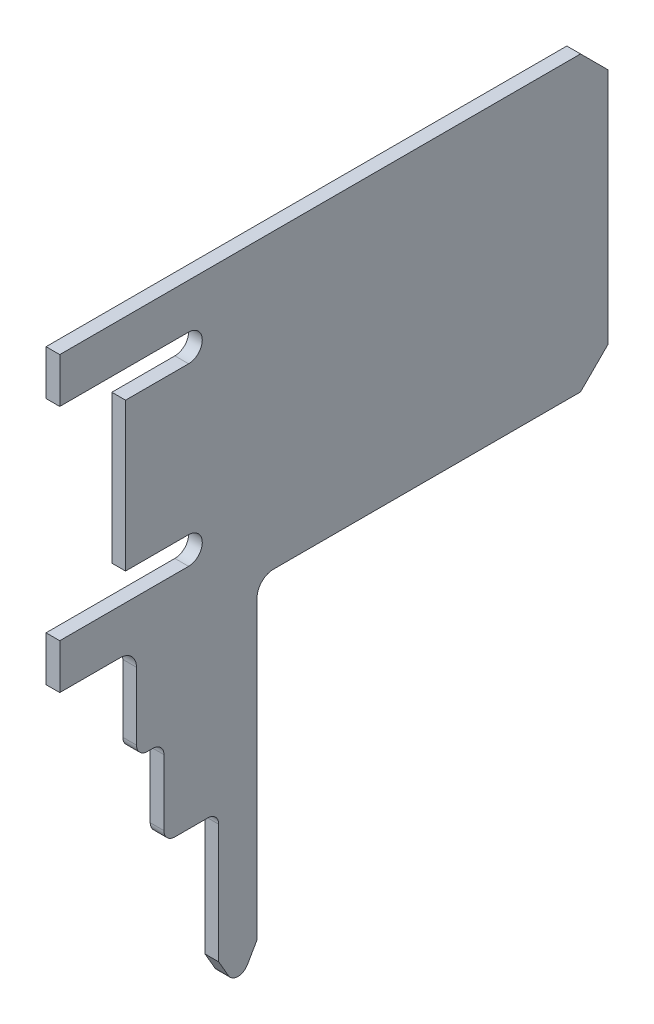
ISO-10303-21;
HEADER;
FILE_DESCRIPTION(('STEP AP214'),'2;1');
FILE_NAME('part.step','',(''),(''),'','','');
FILE_SCHEMA(('AUTOMOTIVE_DESIGN { 1 0 10303 214 1 1 1 1 }'));
ENDSEC;
DATA;
#1=APPLICATION_CONTEXT('core data for automotive mechanical design processes');
#2=APPLICATION_PROTOCOL_DEFINITION('international standard','automotive_design',2000,#1);
#3=PRODUCT_CONTEXT('',#1,'mechanical');
#4=PRODUCT('Part','Part','',(#3));
#5=PRODUCT_RELATED_PRODUCT_CATEGORY('part','',(#4));
#6=PRODUCT_DEFINITION_FORMATION('','',#4);
#7=PRODUCT_DEFINITION_CONTEXT('part definition',#1,'design');
#8=PRODUCT_DEFINITION('design','',#6,#7);
#9=PRODUCT_DEFINITION_SHAPE('','',#8);
#10=(LENGTH_UNIT() NAMED_UNIT(*) SI_UNIT(.MILLI.,.METRE.));
#11=(NAMED_UNIT(*) PLANE_ANGLE_UNIT() SI_UNIT($,.RADIAN.));
#12=(NAMED_UNIT(*) SI_UNIT($,.STERADIAN.) SOLID_ANGLE_UNIT());
#13=UNCERTAINTY_MEASURE_WITH_UNIT(LENGTH_MEASURE(1.E-05),#10,'distance_accuracy_value','');
#14=(GEOMETRIC_REPRESENTATION_CONTEXT(3) GLOBAL_UNCERTAINTY_ASSIGNED_CONTEXT((#13)) GLOBAL_UNIT_ASSIGNED_CONTEXT((#10,
#11,#12)) REPRESENTATION_CONTEXT('',''));
#15=CARTESIAN_POINT('',(0.,0.,0.));
#16=DIRECTION('',(0.,0.,1.));
#17=DIRECTION('',(1.,0.,0.));
#18=AXIS2_PLACEMENT_3D('',#15,#16,#17);
#19=CARTESIAN_POINT('',(10.88,-39.55963411247,-10.2));
#20=DIRECTION('',(-1.,0.,0.));
#21=DIRECTION('',(0.,0.,1.));
#22=AXIS2_PLACEMENT_3D('',#19,#20,#21);
#23=PLANE('',#22);
#24=CARTESIAN_POINT('',(10.88,-35.15,-1.7));
#25=DIRECTION('',(-1.,0.,0.));
#26=DIRECTION('',(0.,0.,1.));
#27=AXIS2_PLACEMENT_3D('',#24,#25,#26);
#28=CIRCLE('',#27,0.200000000000006);
#29=CARTESIAN_POINT('',(10.88,-35.15,-1.9));
#30=VERTEX_POINT('',#29);
#31=CARTESIAN_POINT('',(10.88,-34.95,-1.7));
#32=VERTEX_POINT('',#31);
#33=EDGE_CURVE('E365',#30,#32,#28,.F.);
#34=ORIENTED_EDGE('',*,*,#33,.T.);
#35=DIRECTION('',(0.,0.,-1.));
#36=VECTOR('',#35,1.);
#37=CARTESIAN_POINT('',(10.88,-34.95,-1.65));
#38=LINE('',#37,#36);
#39=CARTESIAN_POINT('',(10.88,-34.95,-1.6));
#40=VERTEX_POINT('',#39);
#41=EDGE_CURVE('E295',#32,#40,#38,.F.);
#42=ORIENTED_EDGE('',*,*,#41,.T.);
#43=CARTESIAN_POINT('',(10.88,-34.75,-1.6));
#44=DIRECTION('',(1.,0.,0.));
#45=DIRECTION('',(0.,0.,-1.));
#46=AXIS2_PLACEMENT_3D('',#43,#44,#45);
#47=CIRCLE('',#46,0.2);
#48=CARTESIAN_POINT('',(10.88,-34.75,-1.4));
#49=VERTEX_POINT('',#48);
#50=EDGE_CURVE('E363',#40,#49,#47,.F.);
#51=ORIENTED_EDGE('',*,*,#50,.T.);
#52=DIRECTION('',(0.,-1.,0.));
#53=VECTOR('',#52,1.);
#54=CARTESIAN_POINT('',(10.88,-34.135,-1.4));
#55=LINE('',#54,#53);
#56=CARTESIAN_POINT('',(10.88,-33.52,-1.4));
#57=VERTEX_POINT('',#56);
#58=EDGE_CURVE('E291',#49,#57,#55,.F.);
#59=ORIENTED_EDGE('',*,*,#58,.T.);
#60=CARTESIAN_POINT('',(10.88,-33.52,-1.1));
#61=DIRECTION('',(-1.,0.,0.));
#62=DIRECTION('',(0.,0.,1.));
#63=AXIS2_PLACEMENT_3D('',#60,#61,#62);
#64=CIRCLE('',#63,0.299999999999995);
#65=CARTESIAN_POINT('',(10.88,-33.22,-1.1));
#66=VERTEX_POINT('',#65);
#67=EDGE_CURVE('E361',#57,#66,#64,.F.);
#68=ORIENTED_EDGE('',*,*,#67,.T.);
#69=DIRECTION('',(0.,0.,-1.));
#70=VECTOR('',#69,1.);
#71=CARTESIAN_POINT('',(10.88,-33.22,-4.75));
#72=LINE('',#71,#70);
#73=CARTESIAN_POINT('',(10.88,-33.22,0.));
#74=VERTEX_POINT('',#73);
#75=EDGE_CURVE('E285',#66,#74,#72,.F.);
#76=ORIENTED_EDGE('',*,*,#75,.T.);
#77=DIRECTION('',(0.,-1.,0.));
#78=VECTOR('',#77,1.);
#79=CARTESIAN_POINT('',(10.88,-30.55,0.));
#80=LINE('',#79,#78);
#81=CARTESIAN_POINT('',(10.88,-32.4,0.));
#82=VERTEX_POINT('',#81);
#83=EDGE_CURVE('E279',#74,#82,#80,.F.);
#84=ORIENTED_EDGE('',*,*,#83,.T.);
#85=DIRECTION('',(0.,0.,-1.));
#86=VECTOR('',#85,1.);
#87=CARTESIAN_POINT('',(10.88,-32.4,-1.175));
#88=LINE('',#87,#86);
#89=CARTESIAN_POINT('',(10.88,-32.4,-2.35));
#90=VERTEX_POINT('',#89);
#91=EDGE_CURVE('E273',#82,#90,#88,.T.);
#92=ORIENTED_EDGE('',*,*,#91,.T.);
#93=CARTESIAN_POINT('',(10.88,-32.15,-2.35));
#94=DIRECTION('',(-1.,0.,0.));
#95=DIRECTION('',(0.,0.,1.));
#96=AXIS2_PLACEMENT_3D('',#93,#94,#95);
#97=CIRCLE('',#96,0.25);
#98=CARTESIAN_POINT('',(10.88,-31.9,-2.35));
#99=VERTEX_POINT('',#98);
#100=EDGE_CURVE('E359',#90,#99,#97,.F.);
#101=ORIENTED_EDGE('',*,*,#100,.T.);
#102=DIRECTION('',(0.,0.,1.));
#103=VECTOR('',#102,1.);
#104=CARTESIAN_POINT('',(10.88,-31.9,-1.775));
#105=LINE('',#104,#103);
#106=CARTESIAN_POINT('',(10.88,-31.9,-1.2));
#107=VERTEX_POINT('',#106);
#108=EDGE_CURVE('E267',#99,#107,#105,.T.);
#109=ORIENTED_EDGE('',*,*,#108,.T.);
#110=DIRECTION('',(0.,1.,0.));
#111=VECTOR('',#110,1.);
#112=CARTESIAN_POINT('',(10.88,-30.55,-1.2));
#113=LINE('',#112,#111);
#114=CARTESIAN_POINT('',(10.88,-29.2,-1.2));
#115=VERTEX_POINT('',#114);
#116=EDGE_CURVE('E261',#107,#115,#113,.T.);
#117=ORIENTED_EDGE('',*,*,#116,.T.);
#118=DIRECTION('',(0.,0.,-1.));
#119=VECTOR('',#118,1.);
#120=CARTESIAN_POINT('',(10.88,-29.2,-1.775));
#121=LINE('',#120,#119);
#122=CARTESIAN_POINT('',(10.88,-29.2,-2.35));
#123=VERTEX_POINT('',#122);
#124=EDGE_CURVE('E255',#115,#123,#121,.T.);
#125=ORIENTED_EDGE('',*,*,#124,.T.);
#126=CARTESIAN_POINT('',(10.88,-28.95,-2.35));
#127=DIRECTION('',(-1.,0.,0.));
#128=DIRECTION('',(0.,0.,1.));
#129=AXIS2_PLACEMENT_3D('',#126,#127,#128);
#130=CIRCLE('',#129,0.25);
#131=CARTESIAN_POINT('',(10.88,-28.7,-2.35));
#132=VERTEX_POINT('',#131);
#133=EDGE_CURVE('E357',#123,#132,#130,.F.);
#134=ORIENTED_EDGE('',*,*,#133,.T.);
#135=DIRECTION('',(0.,0.,1.));
#136=VECTOR('',#135,1.);
#137=CARTESIAN_POINT('',(10.88,-28.7,-1.175));
#138=LINE('',#137,#136);
#139=CARTESIAN_POINT('',(10.88,-28.7,0.));
#140=VERTEX_POINT('',#139);
#141=EDGE_CURVE('E249',#132,#140,#138,.T.);
#142=ORIENTED_EDGE('',*,*,#141,.T.);
#143=DIRECTION('',(0.,-1.,0.));
#144=VECTOR('',#143,1.);
#145=CARTESIAN_POINT('',(10.88,-30.55,0.));
#146=LINE('',#145,#144);
#147=CARTESIAN_POINT('',(10.88,-27.88,0.));
#148=VERTEX_POINT('',#147);
#149=EDGE_CURVE('E243',#140,#148,#146,.F.);
#150=ORIENTED_EDGE('',*,*,#149,.T.);
#151=DIRECTION('',(0.,0.,1.));
#152=VECTOR('',#151,1.);
#153=CARTESIAN_POINT('',(10.88,-27.88,-4.75));
#154=LINE('',#153,#152);
#155=CARTESIAN_POINT('',(10.88,-27.879999999999,-9.50000000000097));
#156=VERTEX_POINT('',#155);
#157=EDGE_CURVE('E237',#148,#156,#154,.F.);
#158=ORIENTED_EDGE('',*,*,#157,.T.);
#159=DIRECTION('',(0.,0.707106781188558,0.707106781184537));
#160=VECTOR('',#159,1.);
#161=CARTESIAN_POINT('',(10.88,-28.13,-9.7500000000015));
#162=LINE('',#161,#160);
#163=CARTESIAN_POINT('',(10.88,-28.38,-10.));
#164=VERTEX_POINT('',#163);
#165=EDGE_CURVE('E231',#156,#164,#162,.F.);
#166=ORIENTED_EDGE('',*,*,#165,.T.);
#167=DIRECTION('',(0.,1.,0.));
#168=VECTOR('',#167,1.);
#169=CARTESIAN_POINT('',(10.88,-30.55,-10.));
#170=LINE('',#169,#168);
#171=CARTESIAN_POINT('',(10.88,-32.72,-10.));
#172=VERTEX_POINT('',#171);
#173=EDGE_CURVE('E225',#164,#172,#170,.F.);
#174=ORIENTED_EDGE('',*,*,#173,.T.);
#175=DIRECTION('',(0.,0.707106781188558,-0.707106781184537));
#176=VECTOR('',#175,1.);
#177=CARTESIAN_POINT('',(10.88,-32.97,-9.7500000000015));
#178=LINE('',#177,#176);
#179=CARTESIAN_POINT('',(10.88,-33.2200000000005,-9.50000000000049));
#180=VERTEX_POINT('',#179);
#181=EDGE_CURVE('E219',#172,#180,#178,.F.);
#182=ORIENTED_EDGE('',*,*,#181,.T.);
#183=DIRECTION('',(0.,0.,-1.));
#184=VECTOR('',#183,1.);
#185=CARTESIAN_POINT('',(10.88,-33.22,-4.75));
#186=LINE('',#185,#184);
#187=CARTESIAN_POINT('',(10.88,-33.22,-3.9));
#188=VERTEX_POINT('',#187);
#189=EDGE_CURVE('E213',#180,#188,#186,.F.);
#190=ORIENTED_EDGE('',*,*,#189,.T.);
#191=CARTESIAN_POINT('',(10.88,-33.52,-3.9));
#192=DIRECTION('',(1.,0.,0.));
#193=DIRECTION('',(0.,0.,-1.));
#194=AXIS2_PLACEMENT_3D('',#191,#192,#193);
#195=CIRCLE('',#194,0.299999999999995);
#196=CARTESIAN_POINT('',(10.88,-33.52,-3.6));
#197=VERTEX_POINT('',#196);
#198=EDGE_CURVE('E210',#188,#197,#195,.T.);
#199=ORIENTED_EDGE('',*,*,#198,.T.);
#200=DIRECTION('',(0.,1.,0.));
#201=VECTOR('',#200,1.);
#202=CARTESIAN_POINT('',(10.88,-36.221891108675,-3.6));
#203=LINE('',#202,#201);
#204=CARTESIAN_POINT('',(10.88,-38.9237822173496,-3.5999999999995));
#205=VERTEX_POINT('',#204);
#206=EDGE_CURVE('E207',#197,#205,#203,.F.);
#207=ORIENTED_EDGE('',*,*,#206,.T.);
#208=DIRECTION('',(0.,0.866025403786435,-0.499999999996542));
#209=VECTOR('',#208,1.);
#210=CARTESIAN_POINT('',(10.88,-39.076891108675,-3.511602540378));
#211=LINE('',#210,#209);
#212=CARTESIAN_POINT('',(10.88,-39.2299999999997,-3.42320508075714));
#213=VERTEX_POINT('',#212);
#214=EDGE_CURVE('E200',#205,#213,#211,.F.);
#215=ORIENTED_EDGE('',*,*,#214,.T.);
#216=CARTESIAN_POINT('',(10.88,-39.13,-3.25));
#217=DIRECTION('',(-1.,0.,0.));
#218=DIRECTION('',(0.,0.,1.));
#219=AXIS2_PLACEMENT_3D('',#216,#217,#218);
#220=CIRCLE('',#219,0.200000000000001);
#221=CARTESIAN_POINT('',(10.88,-39.2299999999997,-3.07679491924281));
#222=VERTEX_POINT('',#221);
#223=EDGE_CURVE('E352',#213,#222,#220,.T.);
#224=ORIENTED_EDGE('',*,*,#223,.T.);
#225=DIRECTION('',(0.,-0.866025403786436,-0.49999999999654));
#226=VECTOR('',#225,1.);
#227=CARTESIAN_POINT('',(10.88,-39.076891108675,-2.988397459622));
#228=LINE('',#227,#226);
#229=CARTESIAN_POINT('',(10.88,-38.9237822173499,-2.90000000000025));
#230=VERTEX_POINT('',#229);
#231=EDGE_CURVE('E194',#222,#230,#228,.F.);
#232=ORIENTED_EDGE('',*,*,#231,.T.);
#233=DIRECTION('',(0.,-1.,0.));
#234=VECTOR('',#233,1.);
#235=CARTESIAN_POINT('',(10.88,-37.836891108675,-2.9));
#236=LINE('',#235,#234);
#237=CARTESIAN_POINT('',(10.88,-36.75,-2.9));
#238=VERTEX_POINT('',#237);
#239=EDGE_CURVE('E176',#230,#238,#236,.F.);
#240=ORIENTED_EDGE('',*,*,#239,.T.);
#241=CARTESIAN_POINT('',(10.88,-36.75,-2.7));
#242=DIRECTION('',(-1.,0.,0.));
#243=DIRECTION('',(0.,0.,1.));
#244=AXIS2_PLACEMENT_3D('',#241,#242,#243);
#245=CIRCLE('',#244,0.199999999999999);
#246=CARTESIAN_POINT('',(10.88,-36.55,-2.7));
#247=VERTEX_POINT('',#246);
#248=EDGE_CURVE('E20',#247,#238,#245,.T.);
#249=ORIENTED_EDGE('',*,*,#248,.F.);
#250=DIRECTION('',(0.,0.,1.));
#251=VECTOR('',#250,1.);
#252=CARTESIAN_POINT('',(10.88,-36.55,-5.));
#253=LINE('',#252,#251);
#254=CARTESIAN_POINT('',(10.88,-36.55,-2.1));
#255=VERTEX_POINT('',#254);
#256=EDGE_CURVE('E172',#255,#247,#253,.F.);
#257=ORIENTED_EDGE('',*,*,#256,.F.);
#258=CARTESIAN_POINT('',(10.88,-36.35,-2.1));
#259=DIRECTION('',(1.,0.,0.));
#260=DIRECTION('',(0.,0.,-1.));
#261=AXIS2_PLACEMENT_3D('',#258,#259,#260);
#262=CIRCLE('',#261,0.2);
#263=CARTESIAN_POINT('',(10.88,-36.35,-1.9));
#264=VERTEX_POINT('',#263);
#265=EDGE_CURVE('E179',#255,#264,#262,.F.);
#266=ORIENTED_EDGE('',*,*,#265,.T.);
#267=DIRECTION('',(0.,-1.,0.));
#268=VECTOR('',#267,1.);
#269=CARTESIAN_POINT('',(10.88,-35.75,-1.9));
#270=LINE('',#269,#268);
#271=EDGE_CURVE('E299',#264,#30,#270,.F.);
#272=ORIENTED_EDGE('',*,*,#271,.T.);
#273=EDGE_LOOP('',(#34,#42,#51,#59,#68,#76,#84,#92,#101,#109,#117,#125,#134,#142,#150,#158,#166,
#174,#182,#190,#199,#207,#215,#224,#232,#240,#249,#257,#266,#272));
#274=FACE_BOUND('',#273,.T.);
#275=ADVANCED_FACE('F16',(#274),#23,.T.);
#276=CARTESIAN_POINT('',(10.88,-36.35,-2.1));
#277=DIRECTION('',(1.,0.,0.));
#278=DIRECTION('',(0.,0.,-1.));
#279=AXIS2_PLACEMENT_3D('',#276,#277,#278);
#280=CYLINDRICAL_SURFACE('',#279,0.2);
#281=DIRECTION('',(1.,0.,0.));
#282=VECTOR('',#281,1.);
#283=CARTESIAN_POINT('',(11.005,-36.35,-1.9));
#284=LINE('',#283,#282);
#285=CARTESIAN_POINT('',(11.13,-36.35,-1.9));
#286=VERTEX_POINT('',#285);
#287=EDGE_CURVE('E302',#286,#264,#284,.F.);
#288=ORIENTED_EDGE('',*,*,#287,.T.);
#289=ORIENTED_EDGE('',*,*,#265,.F.);
#290=DIRECTION('',(-1.,0.,0.));
#291=VECTOR('',#290,1.);
#292=CARTESIAN_POINT('',(11.005,-36.55,-2.1));
#293=LINE('',#292,#291);
#294=CARTESIAN_POINT('',(11.13,-36.55,-2.1));
#295=VERTEX_POINT('',#294);
#296=EDGE_CURVE('E184',#255,#295,#293,.F.);
#297=ORIENTED_EDGE('',*,*,#296,.T.);
#298=CARTESIAN_POINT('',(11.13,-36.35,-2.1));
#299=DIRECTION('',(1.,0.,0.));
#300=DIRECTION('',(0.,0.,-1.));
#301=AXIS2_PLACEMENT_3D('',#298,#299,#300);
#302=CIRCLE('',#301,0.2);
#303=EDGE_CURVE('E183',#295,#286,#302,.F.);
#304=ORIENTED_EDGE('',*,*,#303,.T.);
#305=EDGE_LOOP('',(#288,#289,#297,#304));
#306=FACE_BOUND('',#305,.T.);
#307=ADVANCED_FACE('F490',(#306),#280,.T.);
#308=CARTESIAN_POINT('',(11.14824549536,-36.374,-1.9));
#309=DIRECTION('',(0.,0.,1.));
#310=DIRECTION('',(0.,1.,0.));
#311=AXIS2_PLACEMENT_3D('',#308,#309,#310);
#312=PLANE('',#311);
#313=DIRECTION('',(1.,0.,0.));
#314=VECTOR('',#313,1.);
#315=CARTESIAN_POINT('',(11.005,-35.15,-1.90000000000001));
#316=LINE('',#315,#314);
#317=CARTESIAN_POINT('',(11.13,-35.15,-1.9));
#318=VERTEX_POINT('',#317);
#319=EDGE_CURVE('E301',#318,#30,#316,.F.);
#320=ORIENTED_EDGE('',*,*,#319,.T.);
#321=ORIENTED_EDGE('',*,*,#271,.F.);
#322=ORIENTED_EDGE('',*,*,#287,.F.);
#323=DIRECTION('',(0.,1.,0.));
#324=VECTOR('',#323,1.);
#325=CARTESIAN_POINT('',(11.13,-33.605310839445,-1.9));
#326=LINE('',#325,#324);
#327=EDGE_CURVE('E349',#286,#318,#326,.T.);
#328=ORIENTED_EDGE('',*,*,#327,.T.);
#329=EDGE_LOOP('',(#320,#321,#322,#328));
#330=FACE_BOUND('',#329,.T.);
#331=ADVANCED_FACE('F494',(#330),#312,.T.);
#332=CARTESIAN_POINT('',(11.13,-35.15,-1.7));
#333=DIRECTION('',(-1.,0.,0.));
#334=DIRECTION('',(0.,0.,1.));
#335=AXIS2_PLACEMENT_3D('',#332,#333,#334);
#336=CYLINDRICAL_SURFACE('',#335,0.200000000000006);
#337=ORIENTED_EDGE('',*,*,#319,.F.);
#338=CARTESIAN_POINT('',(11.13,-35.15,-1.7));
#339=DIRECTION('',(-1.,0.,0.));
#340=DIRECTION('',(0.,0.,1.));
#341=AXIS2_PLACEMENT_3D('',#338,#339,#340);
#342=CIRCLE('',#341,0.200000000000006);
#343=CARTESIAN_POINT('',(11.13,-34.95,-1.7));
#344=VERTEX_POINT('',#343);
#345=EDGE_CURVE('E346',#318,#344,#342,.F.);
#346=ORIENTED_EDGE('',*,*,#345,.T.);
#347=DIRECTION('',(1.,0.,0.));
#348=VECTOR('',#347,1.);
#349=CARTESIAN_POINT('',(11.005,-34.95,-1.7));
#350=LINE('',#349,#348);
#351=EDGE_CURVE('E298',#344,#32,#350,.F.);
#352=ORIENTED_EDGE('',*,*,#351,.T.);
#353=ORIENTED_EDGE('',*,*,#33,.F.);
#354=EDGE_LOOP('',(#337,#346,#352,#353));
#355=FACE_BOUND('',#354,.T.);
#356=ADVANCED_FACE('F473',(#355),#336,.F.);
#357=CARTESIAN_POINT('',(11.14824549536,-34.95,-1.718245495363));
#358=DIRECTION('',(0.,-1.,0.));
#359=DIRECTION('',(0.,0.,1.));
#360=AXIS2_PLACEMENT_3D('',#357,#358,#359);
#361=PLANE('',#360);
#362=ORIENTED_EDGE('',*,*,#351,.F.);
#363=DIRECTION('',(0.,0.,1.));
#364=VECTOR('',#363,1.);
#365=CARTESIAN_POINT('',(11.13,-34.95,-5.));
#366=LINE('',#365,#364);
#367=CARTESIAN_POINT('',(11.13,-34.95,-1.6));
#368=VERTEX_POINT('',#367);
#369=EDGE_CURVE('E345',#344,#368,#366,.T.);
#370=ORIENTED_EDGE('',*,*,#369,.T.);
#371=DIRECTION('',(-1.,0.,0.));
#372=VECTOR('',#371,1.);
#373=CARTESIAN_POINT('',(11.005,-34.95,-1.6));
#374=LINE('',#373,#372);
#375=EDGE_CURVE('E297',#368,#40,#374,.T.);
#376=ORIENTED_EDGE('',*,*,#375,.T.);
#377=ORIENTED_EDGE('',*,*,#41,.F.);
#378=EDGE_LOOP('',(#362,#370,#376,#377));
#379=FACE_BOUND('',#378,.T.);
#380=ADVANCED_FACE('F480',(#379),#361,.T.);
#381=CARTESIAN_POINT('',(10.88,-34.75,-1.6));
#382=DIRECTION('',(1.,0.,0.));
#383=DIRECTION('',(0.,0.,-1.));
#384=AXIS2_PLACEMENT_3D('',#381,#382,#383);
#385=CYLINDRICAL_SURFACE('',#384,0.2);
#386=DIRECTION('',(1.,0.,0.));
#387=VECTOR('',#386,1.);
#388=CARTESIAN_POINT('',(11.005,-34.75,-1.4));
#389=LINE('',#388,#387);
#390=CARTESIAN_POINT('',(11.13,-34.75,-1.4));
#391=VERTEX_POINT('',#390);
#392=EDGE_CURVE('E294',#391,#49,#389,.F.);
#393=ORIENTED_EDGE('',*,*,#392,.T.);
#394=ORIENTED_EDGE('',*,*,#50,.F.);
#395=ORIENTED_EDGE('',*,*,#375,.F.);
#396=CARTESIAN_POINT('',(11.13,-34.75,-1.6));
#397=DIRECTION('',(1.,0.,0.));
#398=DIRECTION('',(0.,0.,-1.));
#399=AXIS2_PLACEMENT_3D('',#396,#397,#398);
#400=CIRCLE('',#399,0.2);
#401=EDGE_CURVE('E342',#368,#391,#400,.F.);
#402=ORIENTED_EDGE('',*,*,#401,.T.);
#403=EDGE_LOOP('',(#393,#394,#395,#402));
#404=FACE_BOUND('',#403,.T.);
#405=ADVANCED_FACE('F498',(#404),#385,.T.);
#406=CARTESIAN_POINT('',(11.14824549536,-34.7746,-1.4));
#407=DIRECTION('',(0.,0.,1.));
#408=DIRECTION('',(0.,1.,0.));
#409=AXIS2_PLACEMENT_3D('',#406,#407,#408);
#410=PLANE('',#409);
#411=DIRECTION('',(1.,0.,0.));
#412=VECTOR('',#411,1.);
#413=CARTESIAN_POINT('',(11.005,-33.52,-1.39999999999999));
#414=LINE('',#413,#412);
#415=CARTESIAN_POINT('',(11.13,-33.52,-1.4));
#416=VERTEX_POINT('',#415);
#417=EDGE_CURVE('E293',#416,#57,#414,.F.);
#418=ORIENTED_EDGE('',*,*,#417,.T.);
#419=ORIENTED_EDGE('',*,*,#58,.F.);
#420=ORIENTED_EDGE('',*,*,#392,.F.);
#421=DIRECTION('',(0.,1.,0.));
#422=VECTOR('',#421,1.);
#423=CARTESIAN_POINT('',(11.13,-33.605310839445,-1.4));
#424=LINE('',#423,#422);
#425=EDGE_CURVE('E341',#391,#416,#424,.T.);
#426=ORIENTED_EDGE('',*,*,#425,.T.);
#427=EDGE_LOOP('',(#418,#419,#420,#426));
#428=FACE_BOUND('',#427,.T.);
#429=ADVANCED_FACE('F501',(#428),#410,.T.);
#430=CARTESIAN_POINT('',(11.13,-33.52,-1.1));
#431=DIRECTION('',(-1.,0.,0.));
#432=DIRECTION('',(0.,0.,1.));
#433=AXIS2_PLACEMENT_3D('',#430,#431,#432);
#434=CYLINDRICAL_SURFACE('',#433,0.299999999999995);
#435=ORIENTED_EDGE('',*,*,#417,.F.);
#436=CARTESIAN_POINT('',(11.13,-33.52,-1.1));
#437=DIRECTION('',(-1.,0.,0.));
#438=DIRECTION('',(0.,0.,1.));
#439=AXIS2_PLACEMENT_3D('',#436,#437,#438);
#440=CIRCLE('',#439,0.299999999999995);
#441=CARTESIAN_POINT('',(11.13,-33.22,-1.1));
#442=VERTEX_POINT('',#441);
#443=EDGE_CURVE('E337',#416,#442,#440,.F.);
#444=ORIENTED_EDGE('',*,*,#443,.T.);
#445=DIRECTION('',(1.,0.,0.));
#446=VECTOR('',#445,1.);
#447=CARTESIAN_POINT('',(11.005,-33.22,-1.1));
#448=LINE('',#447,#446);
#449=EDGE_CURVE('E288',#442,#66,#448,.F.);
#450=ORIENTED_EDGE('',*,*,#449,.T.);
#451=ORIENTED_EDGE('',*,*,#67,.F.);
#452=EDGE_LOOP('',(#435,#444,#450,#451));
#453=FACE_BOUND('',#452,.T.);
#454=ADVANCED_FACE('F507',(#453),#434,.F.);
#455=CARTESIAN_POINT('',(11.14824549536,-33.22,-9.69));
#456=DIRECTION('',(0.,-1.,0.));
#457=DIRECTION('',(0.,0.,1.));
#458=AXIS2_PLACEMENT_3D('',#455,#456,#457);
#459=PLANE('',#458);
#460=DIRECTION('',(1.,0.,0.));
#461=VECTOR('',#460,1.);
#462=CARTESIAN_POINT('',(11.005,-33.22,0.));
#463=LINE('',#462,#461);
#464=CARTESIAN_POINT('',(11.13,-33.22,0.));
#465=VERTEX_POINT('',#464);
#466=EDGE_CURVE('E282',#465,#74,#463,.F.);
#467=ORIENTED_EDGE('',*,*,#466,.T.);
#468=ORIENTED_EDGE('',*,*,#75,.F.);
#469=ORIENTED_EDGE('',*,*,#449,.F.);
#470=DIRECTION('',(0.,0.,1.));
#471=VECTOR('',#470,1.);
#472=CARTESIAN_POINT('',(11.13,-33.22,-5.));
#473=LINE('',#472,#471);
#474=EDGE_CURVE('E340',#442,#465,#473,.T.);
#475=ORIENTED_EDGE('',*,*,#474,.T.);
#476=EDGE_LOOP('',(#467,#468,#469,#475));
#477=FACE_BOUND('',#476,.T.);
#478=ADVANCED_FACE('F512',(#477),#459,.T.);
#479=CARTESIAN_POINT('',(11.14824549536,-33.3268,0.));
#480=DIRECTION('',(0.,0.,1.));
#481=DIRECTION('',(0.,1.,0.));
#482=AXIS2_PLACEMENT_3D('',#479,#480,#481);
#483=PLANE('',#482);
#484=ORIENTED_EDGE('',*,*,#466,.F.);
#485=DIRECTION('',(0.,1.,0.));
#486=VECTOR('',#485,1.);
#487=CARTESIAN_POINT('',(11.13,-33.605310839445,0.));
#488=LINE('',#487,#486);
#489=CARTESIAN_POINT('',(11.13,-32.4,0.));
#490=VERTEX_POINT('',#489);
#491=EDGE_CURVE('E454',#465,#490,#488,.T.);
#492=ORIENTED_EDGE('',*,*,#491,.T.);
#493=DIRECTION('',(-1.,0.,0.));
#494=VECTOR('',#493,1.);
#495=CARTESIAN_POINT('',(11.005,-32.4,0.));
#496=LINE('',#495,#494);
#497=EDGE_CURVE('E276',#490,#82,#496,.T.);
#498=ORIENTED_EDGE('',*,*,#497,.T.);
#499=ORIENTED_EDGE('',*,*,#83,.F.);
#500=EDGE_LOOP('',(#484,#492,#498,#499));
#501=FACE_BOUND('',#500,.T.);
#502=ADVANCED_FACE('F515',(#501),#483,.T.);
#503=CARTESIAN_POINT('',(11.14824549536,-32.4,-2.397));
#504=DIRECTION('',(0.,-1.,0.));
#505=DIRECTION('',(0.,0.,1.));
#506=AXIS2_PLACEMENT_3D('',#503,#504,#505);
#507=PLANE('',#506);
#508=ORIENTED_EDGE('',*,*,#91,.F.);
#509=ORIENTED_EDGE('',*,*,#497,.F.);
#510=DIRECTION('',(0.,0.,-1.));
#511=VECTOR('',#510,1.);
#512=CARTESIAN_POINT('',(11.13,-32.4,-5.));
#513=LINE('',#512,#511);
#514=CARTESIAN_POINT('',(11.13,-32.4,-2.35));
#515=VERTEX_POINT('',#514);
#516=EDGE_CURVE('E336',#490,#515,#513,.T.);
#517=ORIENTED_EDGE('',*,*,#516,.T.);
#518=DIRECTION('',(1.,0.,0.));
#519=VECTOR('',#518,1.);
#520=CARTESIAN_POINT('',(11.005,-32.4,-2.35));
#521=LINE('',#520,#519);
#522=EDGE_CURVE('E275',#515,#90,#521,.F.);
#523=ORIENTED_EDGE('',*,*,#522,.T.);
#524=EDGE_LOOP('',(#508,#509,#517,#523));
#525=FACE_BOUND('',#524,.T.);
#526=ADVANCED_FACE('F585',(#525),#507,.F.);
#527=CARTESIAN_POINT('',(11.13,-32.15,-2.35));
#528=DIRECTION('',(-1.,0.,0.));
#529=DIRECTION('',(0.,0.,1.));
#530=AXIS2_PLACEMENT_3D('',#527,#528,#529);
#531=CYLINDRICAL_SURFACE('',#530,0.25);
#532=ORIENTED_EDGE('',*,*,#100,.F.);
#533=ORIENTED_EDGE('',*,*,#522,.F.);
#534=CARTESIAN_POINT('',(11.13,-32.15,-2.35));
#535=DIRECTION('',(-1.,0.,0.));
#536=DIRECTION('',(0.,0.,1.));
#537=AXIS2_PLACEMENT_3D('',#534,#535,#536);
#538=CIRCLE('',#537,0.25);
#539=CARTESIAN_POINT('',(11.13,-31.9,-2.35));
#540=VERTEX_POINT('',#539);
#541=EDGE_CURVE('E332',#515,#540,#538,.F.);
#542=ORIENTED_EDGE('',*,*,#541,.T.);
#543=DIRECTION('',(-1.,0.,0.));
#544=VECTOR('',#543,1.);
#545=CARTESIAN_POINT('',(11.005,-31.9,-2.35));
#546=LINE('',#545,#544);
#547=EDGE_CURVE('E270',#540,#99,#546,.T.);
#548=ORIENTED_EDGE('',*,*,#547,.T.);
#549=EDGE_LOOP('',(#532,#533,#542,#548));
#550=FACE_BOUND('',#549,.T.);
#551=ADVANCED_FACE('F587',(#550),#531,.F.);
#552=CARTESIAN_POINT('',(11.14824549536,-31.9,-1.177));
#553=DIRECTION('',(0.,1.,0.));
#554=DIRECTION('',(0.,0.,-1.));
#555=AXIS2_PLACEMENT_3D('',#552,#553,#554);
#556=PLANE('',#555);
#557=ORIENTED_EDGE('',*,*,#108,.F.);
#558=ORIENTED_EDGE('',*,*,#547,.F.);
#559=DIRECTION('',(0.,0.,1.));
#560=VECTOR('',#559,1.);
#561=CARTESIAN_POINT('',(11.13,-31.9,-5.));
#562=LINE('',#561,#560);
#563=CARTESIAN_POINT('',(11.13,-31.9,-1.2));
#564=VERTEX_POINT('',#563);
#565=EDGE_CURVE('E335',#540,#564,#562,.T.);
#566=ORIENTED_EDGE('',*,*,#565,.T.);
#567=DIRECTION('',(-1.,0.,0.));
#568=VECTOR('',#567,1.);
#569=CARTESIAN_POINT('',(11.005,-31.9,-1.2));
#570=LINE('',#569,#568);
#571=EDGE_CURVE('E264',#564,#107,#570,.T.);
#572=ORIENTED_EDGE('',*,*,#571,.T.);
#573=EDGE_LOOP('',(#557,#558,#566,#572));
#574=FACE_BOUND('',#573,.T.);
#575=ADVANCED_FACE('F591',(#574),#556,.F.);
#576=CARTESIAN_POINT('',(11.14824549536,-29.146,-1.2));
#577=DIRECTION('',(0.,0.,-1.));
#578=DIRECTION('',(0.,-1.,0.));
#579=AXIS2_PLACEMENT_3D('',#576,#577,#578);
#580=PLANE('',#579);
#581=ORIENTED_EDGE('',*,*,#116,.F.);
#582=ORIENTED_EDGE('',*,*,#571,.F.);
#583=DIRECTION('',(0.,1.,0.));
#584=VECTOR('',#583,1.);
#585=CARTESIAN_POINT('',(11.13,-33.605310839445,-1.2));
#586=LINE('',#585,#584);
#587=CARTESIAN_POINT('',(11.13,-29.2,-1.2));
#588=VERTEX_POINT('',#587);
#589=EDGE_CURVE('E437',#564,#588,#586,.T.);
#590=ORIENTED_EDGE('',*,*,#589,.T.);
#591=DIRECTION('',(-1.,0.,0.));
#592=VECTOR('',#591,1.);
#593=CARTESIAN_POINT('',(11.005,-29.2,-1.2));
#594=LINE('',#593,#592);
#595=EDGE_CURVE('E258',#588,#115,#594,.T.);
#596=ORIENTED_EDGE('',*,*,#595,.T.);
#597=EDGE_LOOP('',(#581,#582,#590,#596));
#598=FACE_BOUND('',#597,.T.);
#599=ADVANCED_FACE('F594',(#598),#580,.F.);
#600=CARTESIAN_POINT('',(11.14824549536,-29.2,-2.373));
#601=DIRECTION('',(0.,-1.,0.));
#602=DIRECTION('',(0.,0.,1.));
#603=AXIS2_PLACEMENT_3D('',#600,#601,#602);
#604=PLANE('',#603);
#605=ORIENTED_EDGE('',*,*,#124,.F.);
#606=ORIENTED_EDGE('',*,*,#595,.F.);
#607=DIRECTION('',(0.,0.,-1.));
#608=VECTOR('',#607,1.);
#609=CARTESIAN_POINT('',(11.13,-29.2,-5.));
#610=LINE('',#609,#608);
#611=CARTESIAN_POINT('',(11.13,-29.2,-2.35));
#612=VERTEX_POINT('',#611);
#613=EDGE_CURVE('E331',#588,#612,#610,.T.);
#614=ORIENTED_EDGE('',*,*,#613,.T.);
#615=DIRECTION('',(1.,0.,0.));
#616=VECTOR('',#615,1.);
#617=CARTESIAN_POINT('',(11.005,-29.2,-2.35));
#618=LINE('',#617,#616);
#619=EDGE_CURVE('E257',#612,#123,#618,.F.);
#620=ORIENTED_EDGE('',*,*,#619,.T.);
#621=EDGE_LOOP('',(#605,#606,#614,#620));
#622=FACE_BOUND('',#621,.T.);
#623=ADVANCED_FACE('F600',(#622),#604,.F.);
#624=CARTESIAN_POINT('',(11.13,-28.95,-2.35));
#625=DIRECTION('',(-1.,0.,0.));
#626=DIRECTION('',(0.,0.,1.));
#627=AXIS2_PLACEMENT_3D('',#624,#625,#626);
#628=CYLINDRICAL_SURFACE('',#627,0.25);
#629=ORIENTED_EDGE('',*,*,#133,.F.);
#630=ORIENTED_EDGE('',*,*,#619,.F.);
#631=CARTESIAN_POINT('',(11.13,-28.95,-2.35));
#632=DIRECTION('',(-1.,0.,0.));
#633=DIRECTION('',(0.,0.,1.));
#634=AXIS2_PLACEMENT_3D('',#631,#632,#633);
#635=CIRCLE('',#634,0.25);
#636=CARTESIAN_POINT('',(11.13,-28.7,-2.35));
#637=VERTEX_POINT('',#636);
#638=EDGE_CURVE('E327',#612,#637,#635,.F.);
#639=ORIENTED_EDGE('',*,*,#638,.T.);
#640=DIRECTION('',(-1.,0.,0.));
#641=VECTOR('',#640,1.);
#642=CARTESIAN_POINT('',(11.005,-28.7,-2.35));
#643=LINE('',#642,#641);
#644=EDGE_CURVE('E252',#637,#132,#643,.T.);
#645=ORIENTED_EDGE('',*,*,#644,.T.);
#646=EDGE_LOOP('',(#629,#630,#639,#645));
#647=FACE_BOUND('',#646,.T.);
#648=ADVANCED_FACE('F604',(#647),#628,.F.);
#649=CARTESIAN_POINT('',(11.14824549536,-28.7,0.047));
#650=DIRECTION('',(0.,1.,0.));
#651=DIRECTION('',(0.,0.,-1.));
#652=AXIS2_PLACEMENT_3D('',#649,#650,#651);
#653=PLANE('',#652);
#654=ORIENTED_EDGE('',*,*,#141,.F.);
#655=ORIENTED_EDGE('',*,*,#644,.F.);
#656=DIRECTION('',(0.,0.,1.));
#657=VECTOR('',#656,1.);
#658=CARTESIAN_POINT('',(11.13,-28.7,-5.));
#659=LINE('',#658,#657);
#660=CARTESIAN_POINT('',(11.13,-28.7,0.));
#661=VERTEX_POINT('',#660);
#662=EDGE_CURVE('E330',#637,#661,#659,.T.);
#663=ORIENTED_EDGE('',*,*,#662,.T.);
#664=DIRECTION('',(1.,0.,0.));
#665=VECTOR('',#664,1.);
#666=CARTESIAN_POINT('',(11.005,-28.7,0.));
#667=LINE('',#666,#665);
#668=EDGE_CURVE('E246',#661,#140,#667,.F.);
#669=ORIENTED_EDGE('',*,*,#668,.T.);
#670=EDGE_LOOP('',(#654,#655,#663,#669));
#671=FACE_BOUND('',#670,.T.);
#672=ADVANCED_FACE('F606',(#671),#653,.F.);
#673=CARTESIAN_POINT('',(11.14824549536,-33.3268,0.));
#674=DIRECTION('',(0.,0.,1.));
#675=DIRECTION('',(0.,1.,0.));
#676=AXIS2_PLACEMENT_3D('',#673,#674,#675);
#677=PLANE('',#676);
#678=DIRECTION('',(1.,0.,0.));
#679=VECTOR('',#678,1.);
#680=CARTESIAN_POINT('',(11.005,-27.88,0.));
#681=LINE('',#680,#679);
#682=CARTESIAN_POINT('',(11.13,-27.88,0.));
#683=VERTEX_POINT('',#682);
#684=EDGE_CURVE('E240',#683,#148,#681,.F.);
#685=ORIENTED_EDGE('',*,*,#684,.T.);
#686=ORIENTED_EDGE('',*,*,#149,.F.);
#687=ORIENTED_EDGE('',*,*,#668,.F.);
#688=DIRECTION('',(0.,1.,0.));
#689=VECTOR('',#688,1.);
#690=CARTESIAN_POINT('',(11.13,-33.605310839445,0.));
#691=LINE('',#690,#689);
#692=EDGE_CURVE('E414',#661,#683,#691,.T.);
#693=ORIENTED_EDGE('',*,*,#692,.T.);
#694=EDGE_LOOP('',(#685,#686,#687,#693));
#695=FACE_BOUND('',#694,.T.);
#696=ADVANCED_FACE('F611',(#695),#677,.T.);
#697=CARTESIAN_POINT('',(11.14824549536,-27.88,0.19));
#698=DIRECTION('',(0.,1.,0.));
#699=DIRECTION('',(0.,0.,-1.));
#700=AXIS2_PLACEMENT_3D('',#697,#698,#699);
#701=PLANE('',#700);
#702=ORIENTED_EDGE('',*,*,#157,.F.);
#703=ORIENTED_EDGE('',*,*,#684,.F.);
#704=DIRECTION('',(0.,0.,-1.));
#705=VECTOR('',#704,1.);
#706=CARTESIAN_POINT('',(11.13,-27.88,-5.));
#707=LINE('',#706,#705);
#708=CARTESIAN_POINT('',(11.13,-27.8799999999993,-9.50000000000219));
#709=VERTEX_POINT('',#708);
#710=EDGE_CURVE('E326',#683,#709,#707,.T.);
#711=ORIENTED_EDGE('',*,*,#710,.T.);
#712=DIRECTION('',(1.,0.,0.));
#713=VECTOR('',#712,1.);
#714=CARTESIAN_POINT('',(11.005,-27.8799999999985,-9.50000000000146));
#715=LINE('',#714,#713);
#716=EDGE_CURVE('E234',#709,#156,#715,.F.);
#717=ORIENTED_EDGE('',*,*,#716,.T.);
#718=EDGE_LOOP('',(#702,#703,#711,#717));
#719=FACE_BOUND('',#718,.T.);
#720=ADVANCED_FACE('F616',(#719),#701,.T.);
#721=CARTESIAN_POINT('',(11.14824549536,-28.3929015135,-10.0129015135));
#722=DIRECTION('',(0.,0.707106781184537,-0.707106781188558));
#723=DIRECTION('',(-1.,0.,0.));
#724=AXIS2_PLACEMENT_3D('',#721,#722,#723);
#725=PLANE('',#724);
#726=ORIENTED_EDGE('',*,*,#716,.F.);
#727=DIRECTION('',(0.,0.707106781188558,0.707106781184537));
#728=VECTOR('',#727,1.);
#729=CARTESIAN_POINT('',(11.13,-28.3929015135,-10.0129015135));
#730=LINE('',#729,#728);
#731=CARTESIAN_POINT('',(11.13,-28.38,-10.));
#732=VERTEX_POINT('',#731);
#733=EDGE_CURVE('E323',#709,#732,#730,.F.);
#734=ORIENTED_EDGE('',*,*,#733,.T.);
#735=DIRECTION('',(1.,0.,0.));
#736=VECTOR('',#735,1.);
#737=CARTESIAN_POINT('',(11.005,-28.38,-10.));
#738=LINE('',#737,#736);
#739=EDGE_CURVE('E228',#732,#164,#738,.F.);
#740=ORIENTED_EDGE('',*,*,#739,.T.);
#741=ORIENTED_EDGE('',*,*,#165,.F.);
#742=EDGE_LOOP('',(#726,#734,#740,#741));
#743=FACE_BOUND('',#742,.T.);
#744=ADVANCED_FACE('F618',(#743),#725,.T.);
#745=CARTESIAN_POINT('',(11.14824549536,-28.2932,-10.));
#746=DIRECTION('',(0.,0.,-1.));
#747=DIRECTION('',(0.,-1.,0.));
#748=AXIS2_PLACEMENT_3D('',#745,#746,#747);
#749=PLANE('',#748);
#750=ORIENTED_EDGE('',*,*,#173,.F.);
#751=ORIENTED_EDGE('',*,*,#739,.F.);
#752=DIRECTION('',(0.,-1.,0.));
#753=VECTOR('',#752,1.);
#754=CARTESIAN_POINT('',(11.13,-33.605310839445,-10.));
#755=LINE('',#754,#753);
#756=CARTESIAN_POINT('',(11.13,-32.7200000000001,-10.));
#757=VERTEX_POINT('',#756);
#758=EDGE_CURVE('E322',#732,#757,#755,.T.);
#759=ORIENTED_EDGE('',*,*,#758,.T.);
#760=DIRECTION('',(1.,0.,0.));
#761=VECTOR('',#760,1.);
#762=CARTESIAN_POINT('',(11.005,-32.72,-10.));
#763=LINE('',#762,#761);
#764=EDGE_CURVE('E222',#757,#172,#763,.F.);
#765=ORIENTED_EDGE('',*,*,#764,.T.);
#766=EDGE_LOOP('',(#750,#751,#759,#765));
#767=FACE_BOUND('',#766,.T.);
#768=ADVANCED_FACE('F624',(#767),#749,.T.);
#769=CARTESIAN_POINT('',(11.14824549536,-33.2329015135,-9.487098486503));
#770=DIRECTION('',(0.,-0.707106781184537,-0.707106781188558));
#771=DIRECTION('',(-1.,0.,0.));
#772=AXIS2_PLACEMENT_3D('',#769,#770,#771);
#773=PLANE('',#772);
#774=ORIENTED_EDGE('',*,*,#764,.F.);
#775=DIRECTION('',(0.,0.707106781188558,-0.707106781184537));
#776=VECTOR('',#775,1.);
#777=CARTESIAN_POINT('',(11.13,-33.2329015135,-9.487098486503));
#778=LINE('',#777,#776);
#779=CARTESIAN_POINT('',(11.13,-33.22,-9.50000000000147));
#780=VERTEX_POINT('',#779);
#781=EDGE_CURVE('E319',#757,#780,#778,.F.);
#782=ORIENTED_EDGE('',*,*,#781,.T.);
#783=DIRECTION('',(1.,0.,0.));
#784=VECTOR('',#783,1.);
#785=CARTESIAN_POINT('',(11.005,-33.22,-9.5));
#786=LINE('',#785,#784);
#787=EDGE_CURVE('E216',#780,#180,#786,.F.);
#788=ORIENTED_EDGE('',*,*,#787,.T.);
#789=ORIENTED_EDGE('',*,*,#181,.F.);
#790=EDGE_LOOP('',(#774,#782,#788,#789));
#791=FACE_BOUND('',#790,.T.);
#792=ADVANCED_FACE('F628',(#791),#773,.T.);
#793=CARTESIAN_POINT('',(11.14824549536,-33.22,-9.69));
#794=DIRECTION('',(0.,-1.,0.));
#795=DIRECTION('',(0.,0.,1.));
#796=AXIS2_PLACEMENT_3D('',#793,#794,#795);
#797=PLANE('',#796);
#798=ORIENTED_EDGE('',*,*,#787,.F.);
#799=DIRECTION('',(0.,0.,1.));
#800=VECTOR('',#799,1.);
#801=CARTESIAN_POINT('',(11.13,-33.22,-5.));
#802=LINE('',#801,#800);
#803=CARTESIAN_POINT('',(11.13,-33.22,-3.9));
#804=VERTEX_POINT('',#803);
#805=EDGE_CURVE('E318',#780,#804,#802,.T.);
#806=ORIENTED_EDGE('',*,*,#805,.T.);
#807=DIRECTION('',(1.,0.,0.));
#808=VECTOR('',#807,1.);
#809=CARTESIAN_POINT('',(11.005,-33.22,-3.9));
#810=LINE('',#809,#808);
#811=EDGE_CURVE('E215',#804,#188,#810,.F.);
#812=ORIENTED_EDGE('',*,*,#811,.T.);
#813=ORIENTED_EDGE('',*,*,#189,.F.);
#814=EDGE_LOOP('',(#798,#806,#812,#813));
#815=FACE_BOUND('',#814,.T.);
#816=ADVANCED_FACE('F630',(#815),#797,.T.);
#817=CARTESIAN_POINT('',(10.88,-33.52,-3.9));
#818=DIRECTION('',(1.,0.,0.));
#819=DIRECTION('',(0.,0.,-1.));
#820=AXIS2_PLACEMENT_3D('',#817,#818,#819);
#821=CYLINDRICAL_SURFACE('',#820,0.299999999999995);
#822=DIRECTION('',(1.,0.,0.));
#823=VECTOR('',#822,1.);
#824=CARTESIAN_POINT('',(11.005,-33.52,-3.6));
#825=LINE('',#824,#823);
#826=CARTESIAN_POINT('',(11.13,-33.52,-3.6));
#827=VERTEX_POINT('',#826);
#828=EDGE_CURVE('E204',#827,#197,#825,.F.);
#829=ORIENTED_EDGE('',*,*,#828,.T.);
#830=ORIENTED_EDGE('',*,*,#198,.F.);
#831=ORIENTED_EDGE('',*,*,#811,.F.);
#832=CARTESIAN_POINT('',(11.13,-33.52,-3.9));
#833=DIRECTION('',(1.,0.,0.));
#834=DIRECTION('',(0.,0.,-1.));
#835=AXIS2_PLACEMENT_3D('',#832,#833,#834);
#836=CIRCLE('',#835,0.299999999999995);
#837=EDGE_CURVE('E315',#804,#827,#836,.T.);
#838=ORIENTED_EDGE('',*,*,#837,.T.);
#839=EDGE_LOOP('',(#829,#830,#831,#838));
#840=FACE_BOUND('',#839,.T.);
#841=ADVANCED_FACE('F633',(#840),#821,.F.);
#842=CARTESIAN_POINT('',(11.14824549536,-33.41192435565,-3.6));
#843=DIRECTION('',(0.,0.,-1.));
#844=DIRECTION('',(0.,-1.,0.));
#845=AXIS2_PLACEMENT_3D('',#842,#843,#844);
#846=PLANE('',#845);
#847=DIRECTION('',(0.,-1.,0.));
#848=VECTOR('',#847,1.);
#849=CARTESIAN_POINT('',(11.13,-33.605310839445,-3.6));
#850=LINE('',#849,#848);
#851=CARTESIAN_POINT('',(11.13,-38.9237822173489,-3.59999999999963));
#852=VERTEX_POINT('',#851);
#853=EDGE_CURVE('E314',#827,#852,#850,.T.);
#854=ORIENTED_EDGE('',*,*,#853,.T.);
#855=DIRECTION('',(1.,0.,0.));
#856=VECTOR('',#855,1.);
#857=CARTESIAN_POINT('',(11.005,-38.9237822173496,-3.59999999999925));
#858=LINE('',#857,#856);
#859=EDGE_CURVE('E203',#852,#205,#858,.F.);
#860=ORIENTED_EDGE('',*,*,#859,.T.);
#861=ORIENTED_EDGE('',*,*,#206,.F.);
#862=ORIENTED_EDGE('',*,*,#828,.F.);
#863=EDGE_LOOP('',(#854,#860,#861,#862));
#864=FACE_BOUND('',#863,.T.);
#865=ADVANCED_FACE('F559',(#864),#846,.T.);
#866=CARTESIAN_POINT('',(11.14824549536,-38.90798115486,-3.609122747681));
#867=DIRECTION('',(0.,-0.499999999996543,-0.866025403786435));
#868=DIRECTION('',(0.,-0.866025403786435,0.499999999996543));
#869=AXIS2_PLACEMENT_3D('',#866,#867,#868);
#870=PLANE('',#869);
#871=DIRECTION('',(0.,-0.866025403786435,0.499999999996543));
#872=VECTOR('',#871,1.);
#873=CARTESIAN_POINT('',(11.13,-38.90798115486,-3.609122747681));
#874=LINE('',#873,#872);
#875=CARTESIAN_POINT('',(11.13,-39.2299999999997,-3.42320508075714));
#876=VERTEX_POINT('',#875);
#877=EDGE_CURVE('E311',#852,#876,#874,.T.);
#878=ORIENTED_EDGE('',*,*,#877,.T.);
#879=DIRECTION('',(-1.,0.,0.));
#880=VECTOR('',#879,1.);
#881=CARTESIAN_POINT('',(11.005,-39.23,-3.42320508075691));
#882=LINE('',#881,#880);
#883=EDGE_CURVE('E197',#876,#213,#882,.T.);
#884=ORIENTED_EDGE('',*,*,#883,.T.);
#885=ORIENTED_EDGE('',*,*,#214,.F.);
#886=ORIENTED_EDGE('',*,*,#859,.F.);
#887=EDGE_LOOP('',(#878,#884,#885,#886));
#888=FACE_BOUND('',#887,.T.);
#889=ADVANCED_FACE('F556',(#888),#870,.T.);
#890=CARTESIAN_POINT('',(11.13,-39.13,-3.25));
#891=DIRECTION('',(-1.,0.,0.));
#892=DIRECTION('',(0.,0.,1.));
#893=AXIS2_PLACEMENT_3D('',#890,#891,#892);
#894=CYLINDRICAL_SURFACE('',#893,0.200000000000001);
#895=CARTESIAN_POINT('',(11.13,-39.13,-3.25));
#896=DIRECTION('',(-1.,0.,0.));
#897=DIRECTION('',(0.,0.,1.));
#898=AXIS2_PLACEMENT_3D('',#895,#896,#897);
#899=CIRCLE('',#898,0.200000000000001);
#900=CARTESIAN_POINT('',(11.13,-39.2299999999997,-3.07679491924281));
#901=VERTEX_POINT('',#900);
#902=EDGE_CURVE('E308',#876,#901,#899,.T.);
#903=ORIENTED_EDGE('',*,*,#902,.T.);
#904=DIRECTION('',(1.,0.,0.));
#905=VECTOR('',#904,1.);
#906=CARTESIAN_POINT('',(11.005,-39.23,-3.076794919243));
#907=LINE('',#906,#905);
#908=EDGE_CURVE('E196',#901,#222,#907,.F.);
#909=ORIENTED_EDGE('',*,*,#908,.T.);
#910=ORIENTED_EDGE('',*,*,#223,.F.);
#911=ORIENTED_EDGE('',*,*,#883,.F.);
#912=EDGE_LOOP('',(#903,#909,#910,#911));
#913=FACE_BOUND('',#912,.T.);
#914=ADVANCED_FACE('F552',(#913),#894,.T.);
#915=CARTESIAN_POINT('',(11.14824549536,-39.24580106249,-3.085917666925));
#916=DIRECTION('',(0.,-0.49999999999654,0.866025403786436));
#917=DIRECTION('',(0.,0.866025403786436,0.49999999999654));
#918=AXIS2_PLACEMENT_3D('',#915,#916,#917);
#919=PLANE('',#918);
#920=DIRECTION('',(0.,0.866025403786436,0.49999999999654));
#921=VECTOR('',#920,1.);
#922=CARTESIAN_POINT('',(11.13,-39.24580106249,-3.085917666925));
#923=LINE('',#922,#921);
#924=CARTESIAN_POINT('',(11.13,-38.9237822173491,-2.9));
#925=VERTEX_POINT('',#924);
#926=EDGE_CURVE('E305',#901,#925,#923,.T.);
#927=ORIENTED_EDGE('',*,*,#926,.T.);
#928=DIRECTION('',(1.,0.,0.));
#929=VECTOR('',#928,1.);
#930=CARTESIAN_POINT('',(11.005,-38.92378221735,-2.9));
#931=LINE('',#930,#929);
#932=EDGE_CURVE('E373',#925,#230,#931,.F.);
#933=ORIENTED_EDGE('',*,*,#932,.T.);
#934=ORIENTED_EDGE('',*,*,#231,.F.);
#935=ORIENTED_EDGE('',*,*,#908,.F.);
#936=EDGE_LOOP('',(#927,#933,#934,#935));
#937=FACE_BOUND('',#936,.T.);
#938=ADVANCED_FACE('F550',(#937),#919,.T.);
#939=CARTESIAN_POINT('',(11.14824549536,-38.9672578617,-2.9));
#940=DIRECTION('',(0.,0.,1.));
#941=DIRECTION('',(0.,1.,0.));
#942=AXIS2_PLACEMENT_3D('',#939,#940,#941);
#943=PLANE('',#942);
#944=ORIENTED_EDGE('',*,*,#932,.F.);
#945=DIRECTION('',(0.,1.,0.));
#946=VECTOR('',#945,1.);
#947=CARTESIAN_POINT('',(11.13,-33.605310839445,-2.9));
#948=LINE('',#947,#946);
#949=CARTESIAN_POINT('',(11.13,-36.75,-2.9));
#950=VERTEX_POINT('',#949);
#951=EDGE_CURVE('E304',#925,#950,#948,.T.);
#952=ORIENTED_EDGE('',*,*,#951,.T.);
#953=DIRECTION('',(1.,0.,0.));
#954=VECTOR('',#953,1.);
#955=CARTESIAN_POINT('',(11.005,-36.75,-2.9));
#956=LINE('',#955,#954);
#957=EDGE_CURVE('E372',#950,#238,#956,.F.);
#958=ORIENTED_EDGE('',*,*,#957,.T.);
#959=ORIENTED_EDGE('',*,*,#239,.F.);
#960=EDGE_LOOP('',(#944,#952,#958,#959));
#961=FACE_BOUND('',#960,.T.);
#962=ADVANCED_FACE('F547',(#961),#943,.T.);
#963=CARTESIAN_POINT('',(11.13,-36.75,-2.7));
#964=DIRECTION('',(-1.,0.,0.));
#965=DIRECTION('',(0.,0.,1.));
#966=AXIS2_PLACEMENT_3D('',#963,#964,#965);
#967=CYLINDRICAL_SURFACE('',#966,0.199999999999999);
#968=ORIENTED_EDGE('',*,*,#957,.F.);
#969=CARTESIAN_POINT('',(11.13,-36.75,-2.7));
#970=DIRECTION('',(-1.,0.,0.));
#971=DIRECTION('',(0.,0.,1.));
#972=AXIS2_PLACEMENT_3D('',#969,#970,#971);
#973=CIRCLE('',#972,0.199999999999999);
#974=CARTESIAN_POINT('',(11.13,-36.55,-2.7));
#975=VERTEX_POINT('',#974);
#976=EDGE_CURVE('E26',#950,#975,#973,.F.);
#977=ORIENTED_EDGE('',*,*,#976,.T.);
#978=DIRECTION('',(1.,0.,0.));
#979=VECTOR('',#978,1.);
#980=CARTESIAN_POINT('',(11.005,-36.55,-2.7));
#981=LINE('',#980,#979);
#982=EDGE_CURVE('E34',#975,#247,#981,.F.);
#983=ORIENTED_EDGE('',*,*,#982,.T.);
#984=ORIENTED_EDGE('',*,*,#248,.T.);
#985=EDGE_LOOP('',(#968,#977,#983,#984));
#986=FACE_BOUND('',#985,.T.);
#987=ADVANCED_FACE('F181',(#986),#967,.F.);
#988=CARTESIAN_POINT('',(11.14824549536,-36.55,-2.718245495363));
#989=DIRECTION('',(0.,-1.,0.));
#990=DIRECTION('',(0.,0.,1.));
#991=AXIS2_PLACEMENT_3D('',#988,#989,#990);
#992=PLANE('',#991);
#993=ORIENTED_EDGE('',*,*,#982,.F.);
#994=DIRECTION('',(0.,0.,1.));
#995=VECTOR('',#994,1.);
#996=CARTESIAN_POINT('',(11.13,-36.55,-5.));
#997=LINE('',#996,#995);
#998=EDGE_CURVE('E11',#975,#295,#997,.T.);
#999=ORIENTED_EDGE('',*,*,#998,.T.);
#1000=ORIENTED_EDGE('',*,*,#296,.F.);
#1001=ORIENTED_EDGE('',*,*,#256,.T.);
#1002=EDGE_LOOP('',(#993,#999,#1000,#1001));
#1003=FACE_BOUND('',#1002,.T.);
#1004=ADVANCED_FACE('F187',(#1003),#992,.T.);
#1005=CARTESIAN_POINT('',(11.13,-39.55963411247,-10.2));
#1006=DIRECTION('',(-1.,0.,0.));
#1007=DIRECTION('',(0.,0.,1.));
#1008=AXIS2_PLACEMENT_3D('',#1005,#1006,#1007);
#1009=PLANE('',#1008);
#1010=ORIENTED_EDGE('',*,*,#976,.F.);
#1011=ORIENTED_EDGE('',*,*,#951,.F.);
#1012=ORIENTED_EDGE('',*,*,#926,.F.);
#1013=ORIENTED_EDGE('',*,*,#902,.F.);
#1014=ORIENTED_EDGE('',*,*,#877,.F.);
#1015=ORIENTED_EDGE('',*,*,#853,.F.);
#1016=ORIENTED_EDGE('',*,*,#837,.F.);
#1017=ORIENTED_EDGE('',*,*,#805,.F.);
#1018=ORIENTED_EDGE('',*,*,#781,.F.);
#1019=ORIENTED_EDGE('',*,*,#758,.F.);
#1020=ORIENTED_EDGE('',*,*,#733,.F.);
#1021=ORIENTED_EDGE('',*,*,#710,.F.);
#1022=ORIENTED_EDGE('',*,*,#692,.F.);
#1023=ORIENTED_EDGE('',*,*,#662,.F.);
#1024=ORIENTED_EDGE('',*,*,#638,.F.);
#1025=ORIENTED_EDGE('',*,*,#613,.F.);
#1026=ORIENTED_EDGE('',*,*,#589,.F.);
#1027=ORIENTED_EDGE('',*,*,#565,.F.);
#1028=ORIENTED_EDGE('',*,*,#541,.F.);
#1029=ORIENTED_EDGE('',*,*,#516,.F.);
#1030=ORIENTED_EDGE('',*,*,#491,.F.);
#1031=ORIENTED_EDGE('',*,*,#474,.F.);
#1032=ORIENTED_EDGE('',*,*,#443,.F.);
#1033=ORIENTED_EDGE('',*,*,#425,.F.);
#1034=ORIENTED_EDGE('',*,*,#401,.F.);
#1035=ORIENTED_EDGE('',*,*,#369,.F.);
#1036=ORIENTED_EDGE('',*,*,#345,.F.);
#1037=ORIENTED_EDGE('',*,*,#327,.F.);
#1038=ORIENTED_EDGE('',*,*,#303,.F.);
#1039=ORIENTED_EDGE('',*,*,#998,.F.);
#1040=EDGE_LOOP('',(#1010,#1011,#1012,#1013,#1014,#1015,#1016,#1017,#1018,#1019,#1020,#1021,
#1022,#1023,#1024,#1025,#1026,#1027,#1028,#1029,#1030,#1031,#1032,#1033,#1034,#1035,#1036,#1037,
#1038,#1039));
#1041=FACE_BOUND('',#1040,.T.);
#1042=ADVANCED_FACE('F18',(#1041),#1009,.F.);
#1043=CLOSED_SHELL('',(#275,#307,#331,#356,#380,#405,#429,#454,#478,#502,#526,#551,#575,#599,
#623,#648,#672,#696,#720,#744,#768,#792,#816,#841,#865,#889,#914,#938,#962,#987,#1004,#1042));
#1044=MANIFOLD_SOLID_BREP('B1',#1043);
#1045=ADVANCED_BREP_SHAPE_REPRESENTATION('',(#18,#1044),#14);
#1046=SHAPE_DEFINITION_REPRESENTATION(#9,#1045);
ENDSEC;
END-ISO-10303-21;
